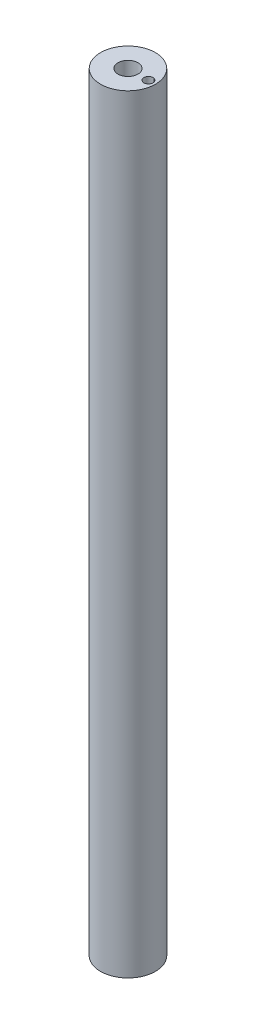
ISO-10303-21;
HEADER;
FILE_DESCRIPTION(('STEP AP214'),'2;1');
FILE_NAME('part.step','',(''),(''),'','','');
FILE_SCHEMA(('AUTOMOTIVE_DESIGN { 1 0 10303 214 1 1 1 1 }'));
ENDSEC;
DATA;
#1=APPLICATION_CONTEXT('core data for automotive mechanical design processes');
#2=APPLICATION_PROTOCOL_DEFINITION('international standard','automotive_design',2000,#1);
#3=PRODUCT_CONTEXT('',#1,'mechanical');
#4=PRODUCT('Part','Part','',(#3));
#5=PRODUCT_RELATED_PRODUCT_CATEGORY('part','',(#4));
#6=PRODUCT_DEFINITION_FORMATION('','',#4);
#7=PRODUCT_DEFINITION_CONTEXT('part definition',#1,'design');
#8=PRODUCT_DEFINITION('design','',#6,#7);
#9=PRODUCT_DEFINITION_SHAPE('','',#8);
#10=(LENGTH_UNIT() NAMED_UNIT(*) SI_UNIT(.MILLI.,.METRE.));
#11=(NAMED_UNIT(*) PLANE_ANGLE_UNIT() SI_UNIT($,.RADIAN.));
#12=(NAMED_UNIT(*) SI_UNIT($,.STERADIAN.) SOLID_ANGLE_UNIT());
#13=UNCERTAINTY_MEASURE_WITH_UNIT(LENGTH_MEASURE(1.E-05),#10,'distance_accuracy_value','');
#14=(GEOMETRIC_REPRESENTATION_CONTEXT(3) GLOBAL_UNCERTAINTY_ASSIGNED_CONTEXT((#13)) GLOBAL_UNIT_ASSIGNED_CONTEXT((#10,
#11,#12)) REPRESENTATION_CONTEXT('',''));
#15=CARTESIAN_POINT('',(0.,0.,0.));
#16=DIRECTION('',(0.,0.,1.));
#17=DIRECTION('',(1.,0.,0.));
#18=AXIS2_PLACEMENT_3D('',#15,#16,#17);
#19=CARTESIAN_POINT('',(0.,133.35,0.));
#20=DIRECTION('',(0.,-1.,0.));
#21=DIRECTION('',(0.,0.,-1.));
#22=AXIS2_PLACEMENT_3D('',#19,#20,#21);
#23=CYLINDRICAL_SURFACE('',#22,4.7625);
#24=CARTESIAN_POINT('',(0.,133.35,0.));
#25=DIRECTION('',(0.,1.,0.));
#26=DIRECTION('',(0.,0.,1.));
#27=AXIS2_PLACEMENT_3D('',#24,#25,#26);
#28=CIRCLE('',#27,4.7625);
#29=CARTESIAN_POINT('',(0.,133.35,4.7625));
#30=VERTEX_POINT('',#29);
#31=EDGE_CURVE('E11',#30,#30,#28,.T.);
#32=ORIENTED_EDGE('',*,*,#31,.F.);
#33=EDGE_LOOP('',(#32));
#34=FACE_BOUND('',#33,.T.);
#35=CARTESIAN_POINT('',(0.,0.,0.));
#36=DIRECTION('',(0.,1.,0.));
#37=DIRECTION('',(0.,0.,1.));
#38=AXIS2_PLACEMENT_3D('',#35,#36,#37);
#39=CIRCLE('',#38,4.7625);
#40=CARTESIAN_POINT('',(0.,0.,4.7625));
#41=VERTEX_POINT('',#40);
#42=EDGE_CURVE('E45',#41,#41,#39,.T.);
#43=ORIENTED_EDGE('',*,*,#42,.T.);
#44=EDGE_LOOP('',(#43));
#45=FACE_BOUND('',#44,.T.);
#46=ADVANCED_FACE('F42',(#34,#45),#23,.T.);
#47=CARTESIAN_POINT('',(0.,133.35,0.));
#48=DIRECTION('',(0.,1.,0.));
#49=DIRECTION('',(0.,0.,1.));
#50=AXIS2_PLACEMENT_3D('',#47,#48,#49);
#51=PLANE('',#50);
#52=CARTESIAN_POINT('',(3.556,133.35,0.));
#53=DIRECTION('',(0.,1.,0.));
#54=DIRECTION('',(0.,0.,1.));
#55=AXIS2_PLACEMENT_3D('',#52,#53,#54);
#56=CIRCLE('',#55,0.793749999999989);
#57=CARTESIAN_POINT('',(3.556,133.35,0.793749999999989));
#58=VERTEX_POINT('',#57);
#59=EDGE_CURVE('E74',#58,#58,#56,.T.);
#60=ORIENTED_EDGE('',*,*,#59,.F.);
#61=EDGE_LOOP('',(#60));
#62=FACE_BOUND('',#61,.T.);
#63=CARTESIAN_POINT('',(0.,133.35,0.));
#64=DIRECTION('',(0.,1.,0.));
#65=DIRECTION('',(0.,0.,1.));
#66=AXIS2_PLACEMENT_3D('',#63,#64,#65);
#67=CIRCLE('',#66,1.7272);
#68=CARTESIAN_POINT('',(0.,133.35,1.7272));
#69=VERTEX_POINT('',#68);
#70=EDGE_CURVE('E88',#69,#69,#67,.T.);
#71=ORIENTED_EDGE('',*,*,#70,.F.);
#72=EDGE_LOOP('',(#71));
#73=FACE_BOUND('',#72,.T.);
#74=ORIENTED_EDGE('',*,*,#31,.T.);
#75=EDGE_LOOP('',(#74));
#76=FACE_BOUND('',#75,.T.);
#77=ADVANCED_FACE('F113',(#62,#73,#76),#51,.T.);
#78=CARTESIAN_POINT('',(0.,0.,0.));
#79=DIRECTION('',(0.,1.,0.));
#80=DIRECTION('',(0.,0.,1.));
#81=AXIS2_PLACEMENT_3D('',#78,#79,#80);
#82=PLANE('',#81);
#83=CARTESIAN_POINT('',(3.556,0.,0.));
#84=DIRECTION('',(0.,-1.,0.));
#85=DIRECTION('',(0.,0.,-1.));
#86=AXIS2_PLACEMENT_3D('',#83,#84,#85);
#87=CIRCLE('',#86,0.793749999999989);
#88=CARTESIAN_POINT('',(3.556,0.,-0.793749999999989));
#89=VERTEX_POINT('',#88);
#90=EDGE_CURVE('E75',#89,#89,#87,.T.);
#91=ORIENTED_EDGE('',*,*,#90,.F.);
#92=EDGE_LOOP('',(#91));
#93=FACE_BOUND('',#92,.T.);
#94=CARTESIAN_POINT('',(0.,0.,0.));
#95=DIRECTION('',(0.,-1.,0.));
#96=DIRECTION('',(0.,0.,-1.));
#97=AXIS2_PLACEMENT_3D('',#94,#95,#96);
#98=CIRCLE('',#97,1.7272);
#99=CARTESIAN_POINT('',(0.,0.,-1.7272));
#100=VERTEX_POINT('',#99);
#101=EDGE_CURVE('E96',#100,#100,#98,.T.);
#102=ORIENTED_EDGE('',*,*,#101,.F.);
#103=EDGE_LOOP('',(#102));
#104=FACE_BOUND('',#103,.T.);
#105=ORIENTED_EDGE('',*,*,#42,.F.);
#106=EDGE_LOOP('',(#105));
#107=FACE_BOUND('',#106,.T.);
#108=ADVANCED_FACE('F110',(#93,#104,#107),#82,.F.);
#109=CARTESIAN_POINT('',(0.,10.668,0.));
#110=DIRECTION('',(0.,-1.,0.));
#111=DIRECTION('',(0.,0.,-1.));
#112=AXIS2_PLACEMENT_3D('',#109,#110,#111);
#113=CONICAL_SURFACE('',#112,1.7272,1.02974425867665);
#114=CARTESIAN_POINT('',(0.,11.7058064611844,0.));
#115=VERTEX_POINT('',#114);
#116=VERTEX_LOOP('',#115);
#117=FACE_BOUND('',#116,.T.);
#118=CARTESIAN_POINT('',(0.,10.668,0.));
#119=DIRECTION('',(0.,-1.,0.));
#120=DIRECTION('',(0.,0.,-1.));
#121=AXIS2_PLACEMENT_3D('',#118,#119,#120);
#122=CIRCLE('',#121,1.7272);
#123=CARTESIAN_POINT('',(0.,10.668,-1.7272));
#124=VERTEX_POINT('',#123);
#125=EDGE_CURVE('E100',#124,#124,#122,.T.);
#126=ORIENTED_EDGE('',*,*,#125,.T.);
#127=EDGE_LOOP('',(#126));
#128=FACE_BOUND('',#127,.T.);
#129=ADVANCED_FACE('F112',(#117,#128),#113,.F.);
#130=CARTESIAN_POINT('',(0.,0.,0.));
#131=DIRECTION('',(0.,-1.,0.));
#132=DIRECTION('',(0.,0.,-1.));
#133=AXIS2_PLACEMENT_3D('',#130,#131,#132);
#134=CYLINDRICAL_SURFACE('',#133,1.7272);
#135=ORIENTED_EDGE('',*,*,#125,.F.);
#136=EDGE_LOOP('',(#135));
#137=FACE_BOUND('',#136,.T.);
#138=ORIENTED_EDGE('',*,*,#101,.T.);
#139=EDGE_LOOP('',(#138));
#140=FACE_BOUND('',#139,.T.);
#141=ADVANCED_FACE('F119',(#137,#140),#134,.F.);
#142=CARTESIAN_POINT('',(0.,122.682,0.));
#143=DIRECTION('',(0.,1.,0.));
#144=DIRECTION('',(0.,0.,1.));
#145=AXIS2_PLACEMENT_3D('',#142,#143,#144);
#146=CONICAL_SURFACE('',#145,1.7272,1.02974425867665);
#147=CARTESIAN_POINT('',(0.,121.644193538816,0.));
#148=VERTEX_POINT('',#147);
#149=VERTEX_LOOP('',#148);
#150=FACE_BOUND('',#149,.T.);
#151=CARTESIAN_POINT('',(0.,122.682,0.));
#152=DIRECTION('',(0.,1.,0.));
#153=DIRECTION('',(0.,0.,1.));
#154=AXIS2_PLACEMENT_3D('',#151,#152,#153);
#155=CIRCLE('',#154,1.7272);
#156=CARTESIAN_POINT('',(0.,122.682,1.7272));
#157=VERTEX_POINT('',#156);
#158=EDGE_CURVE('E92',#157,#157,#155,.T.);
#159=ORIENTED_EDGE('',*,*,#158,.T.);
#160=EDGE_LOOP('',(#159));
#161=FACE_BOUND('',#160,.T.);
#162=ADVANCED_FACE('F188',(#150,#161),#146,.F.);
#163=CARTESIAN_POINT('',(0.,133.35,0.));
#164=DIRECTION('',(0.,1.,0.));
#165=DIRECTION('',(0.,0.,1.));
#166=AXIS2_PLACEMENT_3D('',#163,#164,#165);
#167=CYLINDRICAL_SURFACE('',#166,1.7272);
#168=ORIENTED_EDGE('',*,*,#158,.F.);
#169=EDGE_LOOP('',(#168));
#170=FACE_BOUND('',#169,.T.);
#171=ORIENTED_EDGE('',*,*,#70,.T.);
#172=EDGE_LOOP('',(#171));
#173=FACE_BOUND('',#172,.T.);
#174=ADVANCED_FACE('F142',(#170,#173),#167,.F.);
#175=CARTESIAN_POINT('',(3.556,128.5875,0.));
#176=DIRECTION('',(0.,1.,0.));
#177=DIRECTION('',(0.,0.,1.));
#178=AXIS2_PLACEMENT_3D('',#175,#176,#177);
#179=CONICAL_SURFACE('',#178,0.793749999999998,1.02974425867665);
#180=CARTESIAN_POINT('',(3.556,128.110566883647,0.));
#181=VERTEX_POINT('',#180);
#182=VERTEX_LOOP('',#181);
#183=FACE_BOUND('',#182,.T.);
#184=CARTESIAN_POINT('',(3.556,128.5875,0.));
#185=DIRECTION('',(0.,1.,0.));
#186=DIRECTION('',(0.,0.,1.));
#187=AXIS2_PLACEMENT_3D('',#184,#185,#186);
#188=CIRCLE('',#187,0.793749999999998);
#189=CARTESIAN_POINT('',(3.556,128.5875,0.793749999999998));
#190=VERTEX_POINT('',#189);
#191=EDGE_CURVE('E80',#190,#190,#188,.T.);
#192=ORIENTED_EDGE('',*,*,#191,.T.);
#193=EDGE_LOOP('',(#192));
#194=FACE_BOUND('',#193,.T.);
#195=ADVANCED_FACE('F152',(#183,#194),#179,.F.);
#196=CARTESIAN_POINT('',(3.556,133.35,0.));
#197=DIRECTION('',(0.,1.,0.));
#198=DIRECTION('',(0.,0.,1.));
#199=AXIS2_PLACEMENT_3D('',#196,#197,#198);
#200=CYLINDRICAL_SURFACE('',#199,0.793749999999994);
#201=ORIENTED_EDGE('',*,*,#191,.F.);
#202=EDGE_LOOP('',(#201));
#203=FACE_BOUND('',#202,.T.);
#204=ORIENTED_EDGE('',*,*,#59,.T.);
#205=EDGE_LOOP('',(#204));
#206=FACE_BOUND('',#205,.T.);
#207=ADVANCED_FACE('F67',(#203,#206),#200,.F.);
#208=CARTESIAN_POINT('',(3.556,4.7625,0.));
#209=DIRECTION('',(0.,-1.,0.));
#210=DIRECTION('',(0.,0.,-1.));
#211=AXIS2_PLACEMENT_3D('',#208,#209,#210);
#212=CONICAL_SURFACE('',#211,0.793749999999998,1.02974425867665);
#213=CARTESIAN_POINT('',(3.556,5.23943311635313,0.));
#214=VERTEX_POINT('',#213);
#215=VERTEX_LOOP('',#214);
#216=FACE_BOUND('',#215,.T.);
#217=CARTESIAN_POINT('',(3.556,4.7625,0.));
#218=DIRECTION('',(0.,-1.,0.));
#219=DIRECTION('',(0.,0.,-1.));
#220=AXIS2_PLACEMENT_3D('',#217,#218,#219);
#221=CIRCLE('',#220,0.793749999999998);
#222=CARTESIAN_POINT('',(3.556,4.7625,-0.793749999999998));
#223=VERTEX_POINT('',#222);
#224=EDGE_CURVE('E71',#223,#223,#221,.T.);
#225=ORIENTED_EDGE('',*,*,#224,.T.);
#226=EDGE_LOOP('',(#225));
#227=FACE_BOUND('',#226,.T.);
#228=ADVANCED_FACE('F63',(#216,#227),#212,.F.);
#229=CARTESIAN_POINT('',(3.556,0.,0.));
#230=DIRECTION('',(0.,-1.,0.));
#231=DIRECTION('',(0.,0.,-1.));
#232=AXIS2_PLACEMENT_3D('',#229,#230,#231);
#233=CYLINDRICAL_SURFACE('',#232,0.793749999999994);
#234=ORIENTED_EDGE('',*,*,#224,.F.);
#235=EDGE_LOOP('',(#234));
#236=FACE_BOUND('',#235,.T.);
#237=ORIENTED_EDGE('',*,*,#90,.T.);
#238=EDGE_LOOP('',(#237));
#239=FACE_BOUND('',#238,.T.);
#240=ADVANCED_FACE('F66',(#236,#239),#233,.F.);
#241=CLOSED_SHELL('',(#46,#77,#108,#129,#141,#162,#174,#195,#207,#228,#240));
#242=MANIFOLD_SOLID_BREP('B2',#241);
#243=ADVANCED_BREP_SHAPE_REPRESENTATION('',(#18,#242),#14);
#244=SHAPE_DEFINITION_REPRESENTATION(#9,#243);
ENDSEC;
END-ISO-10303-21;
